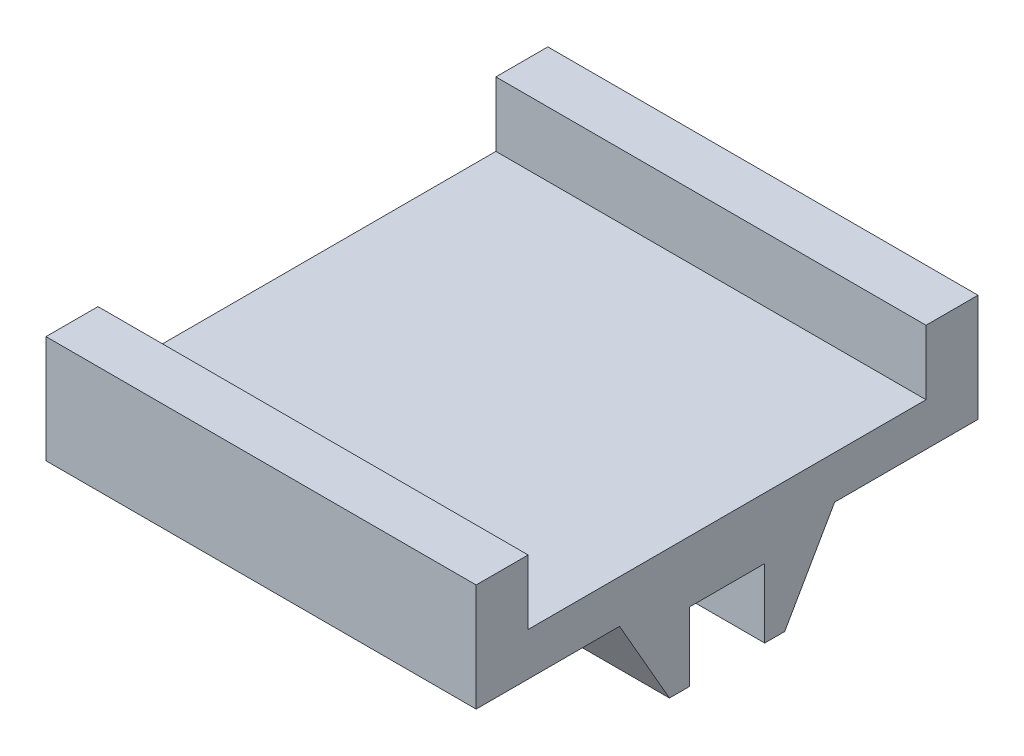
ISO-10303-21;
HEADER;
FILE_DESCRIPTION(('STEP AP214'),'2;1');
FILE_NAME('part.step','',(''),(''),'','','');
FILE_SCHEMA(('AUTOMOTIVE_DESIGN { 1 0 10303 214 1 1 1 1 }'));
ENDSEC;
DATA;
#1=APPLICATION_CONTEXT('core data for automotive mechanical design processes');
#2=APPLICATION_PROTOCOL_DEFINITION('international standard','automotive_design',2000,#1);
#3=PRODUCT_CONTEXT('',#1,'mechanical');
#4=PRODUCT('Part','Part','',(#3));
#5=PRODUCT_RELATED_PRODUCT_CATEGORY('part','',(#4));
#6=PRODUCT_DEFINITION_FORMATION('','',#4);
#7=PRODUCT_DEFINITION_CONTEXT('part definition',#1,'design');
#8=PRODUCT_DEFINITION('design','',#6,#7);
#9=PRODUCT_DEFINITION_SHAPE('','',#8);
#10=(LENGTH_UNIT() NAMED_UNIT(*) SI_UNIT(.MILLI.,.METRE.));
#11=(NAMED_UNIT(*) PLANE_ANGLE_UNIT() SI_UNIT($,.RADIAN.));
#12=(NAMED_UNIT(*) SI_UNIT($,.STERADIAN.) SOLID_ANGLE_UNIT());
#13=UNCERTAINTY_MEASURE_WITH_UNIT(LENGTH_MEASURE(1.E-05),#10,'distance_accuracy_value','');
#14=(GEOMETRIC_REPRESENTATION_CONTEXT(3) GLOBAL_UNCERTAINTY_ASSIGNED_CONTEXT((#13)) GLOBAL_UNIT_ASSIGNED_CONTEXT((#10,
#11,#12)) REPRESENTATION_CONTEXT('',''));
#15=CARTESIAN_POINT('',(0.,0.,0.));
#16=DIRECTION('',(0.,0.,1.));
#17=DIRECTION('',(1.,0.,0.));
#18=AXIS2_PLACEMENT_3D('',#15,#16,#17);
#19=CARTESIAN_POINT('',(0.,0.,0.));
#20=DIRECTION('',(0.,1.,0.));
#21=DIRECTION('',(0.,0.,1.));
#22=AXIS2_PLACEMENT_3D('',#19,#20,#21);
#23=PLANE('',#22);
#24=DIRECTION('',(-1.,0.,0.));
#25=VECTOR('',#24,1.);
#26=CARTESIAN_POINT('',(25.5472350230415,0.,-16.1117511520737));
#27=LINE('',#26,#25);
#28=CARTESIAN_POINT('',(25.5472350230415,0.,-16.1117511520737));
#29=VERTEX_POINT('',#28);
#30=CARTESIAN_POINT('',(-34.4527649769585,0.,-16.1117511520737));
#31=VERTEX_POINT('',#30);
#32=EDGE_CURVE('E224',#29,#31,#27,.T.);
#33=ORIENTED_EDGE('',*,*,#32,.F.);
#34=DIRECTION('',(0.,0.,-1.));
#35=VECTOR('',#34,1.);
#36=CARTESIAN_POINT('',(25.5472350230415,0.,3.88824884792627));
#37=LINE('',#36,#35);
#38=CARTESIAN_POINT('',(25.5472350230415,0.,3.88824884792627));
#39=VERTEX_POINT('',#38);
#40=EDGE_CURVE('E279',#39,#29,#37,.T.);
#41=ORIENTED_EDGE('',*,*,#40,.F.);
#42=DIRECTION('',(1.,0.,0.));
#43=VECTOR('',#42,1.);
#44=CARTESIAN_POINT('',(-34.4527649769585,0.,3.88824884792627));
#45=LINE('',#44,#43);
#46=CARTESIAN_POINT('',(-34.4527649769585,0.,3.88824884792627));
#47=VERTEX_POINT('',#46);
#48=EDGE_CURVE('E301',#47,#39,#45,.T.);
#49=ORIENTED_EDGE('',*,*,#48,.F.);
#50=DIRECTION('',(0.,0.,1.));
#51=VECTOR('',#50,1.);
#52=CARTESIAN_POINT('',(-34.4527649769585,0.,-66.1117511520737));
#53=LINE('',#52,#51);
#54=EDGE_CURVE('E296',#31,#47,#53,.T.);
#55=ORIENTED_EDGE('',*,*,#54,.F.);
#56=EDGE_LOOP('',(#33,#41,#49,#55));
#57=FACE_BOUND('',#56,.T.);
#58=ADVANCED_FACE('F39',(#57),#23,.F.);
#59=CARTESIAN_POINT('',(0.,15.,0.));
#60=DIRECTION('',(0.,1.,0.));
#61=DIRECTION('',(0.,0.,1.));
#62=AXIS2_PLACEMENT_3D('',#59,#60,#61);
#63=PLANE('',#62);
#64=DIRECTION('',(-1.,0.,0.));
#65=VECTOR('',#64,1.);
#66=CARTESIAN_POINT('',(25.5472350230415,15.,-3.36175115207375));
#67=LINE('',#66,#65);
#68=CARTESIAN_POINT('',(25.5472350230415,15.,-3.36175115207375));
#69=VERTEX_POINT('',#68);
#70=CARTESIAN_POINT('',(-34.4527649769585,15.,-3.36175115207373));
#71=VERTEX_POINT('',#70);
#72=EDGE_CURVE('E261',#69,#71,#67,.T.);
#73=ORIENTED_EDGE('',*,*,#72,.T.);
#74=DIRECTION('',(0.,0.,1.));
#75=VECTOR('',#74,1.);
#76=CARTESIAN_POINT('',(-34.4527649769585,15.,-66.1117511520737));
#77=LINE('',#76,#75);
#78=CARTESIAN_POINT('',(-34.4527649769585,15.,3.88824884792627));
#79=VERTEX_POINT('',#78);
#80=EDGE_CURVE('E278',#71,#79,#77,.T.);
#81=ORIENTED_EDGE('',*,*,#80,.T.);
#82=DIRECTION('',(1.,0.,0.));
#83=VECTOR('',#82,1.);
#84=CARTESIAN_POINT('',(-34.4527649769585,15.,3.88824884792627));
#85=LINE('',#84,#83);
#86=CARTESIAN_POINT('',(25.5472350230415,15.,3.88824884792627));
#87=VERTEX_POINT('',#86);
#88=EDGE_CURVE('E284',#79,#87,#85,.T.);
#89=ORIENTED_EDGE('',*,*,#88,.T.);
#90=DIRECTION('',(0.,0.,-1.));
#91=VECTOR('',#90,1.);
#92=CARTESIAN_POINT('',(25.5472350230415,15.,3.88824884792627));
#93=LINE('',#92,#91);
#94=EDGE_CURVE('E288',#87,#69,#93,.T.);
#95=ORIENTED_EDGE('',*,*,#94,.T.);
#96=EDGE_LOOP('',(#73,#81,#89,#95));
#97=FACE_BOUND('',#96,.T.);
#98=ADVANCED_FACE('F333',(#97),#63,.T.);
#99=CARTESIAN_POINT('',(25.5472350230415,15.,-66.1117511520737));
#100=DIRECTION('',(0.,0.,1.));
#101=DIRECTION('',(1.,0.,0.));
#102=AXIS2_PLACEMENT_3D('',#99,#100,#101);
#103=PLANE('',#102);
#104=DIRECTION('',(-1.,0.,0.));
#105=VECTOR('',#104,1.);
#106=CARTESIAN_POINT('',(25.5472350230415,0.,-66.1117511520737));
#107=LINE('',#106,#105);
#108=CARTESIAN_POINT('',(25.5472350230415,0.,-66.1117511520737));
#109=VERTEX_POINT('',#108);
#110=CARTESIAN_POINT('',(-34.4527649769585,0.,-66.1117511520737));
#111=VERTEX_POINT('',#110);
#112=EDGE_CURVE('E265',#109,#111,#107,.T.);
#113=ORIENTED_EDGE('',*,*,#112,.T.);
#114=DIRECTION('',(0.,-1.,0.));
#115=VECTOR('',#114,1.);
#116=CARTESIAN_POINT('',(-34.4527649769585,15.,-66.1117511520737));
#117=LINE('',#116,#115);
#118=CARTESIAN_POINT('',(-34.4527649769585,15.,-66.1117511520737));
#119=VERTEX_POINT('',#118);
#120=EDGE_CURVE('E11',#119,#111,#117,.T.);
#121=ORIENTED_EDGE('',*,*,#120,.F.);
#122=DIRECTION('',(-1.,0.,0.));
#123=VECTOR('',#122,1.);
#124=CARTESIAN_POINT('',(25.5472350230415,15.,-66.1117511520737));
#125=LINE('',#124,#123);
#126=CARTESIAN_POINT('',(25.5472350230415,15.,-66.1117511520737));
#127=VERTEX_POINT('',#126);
#128=EDGE_CURVE('E274',#127,#119,#125,.T.);
#129=ORIENTED_EDGE('',*,*,#128,.F.);
#130=DIRECTION('',(0.,-1.,0.));
#131=VECTOR('',#130,1.);
#132=CARTESIAN_POINT('',(25.5472350230415,15.,-66.1117511520737));
#133=LINE('',#132,#131);
#134=EDGE_CURVE('E292',#127,#109,#133,.T.);
#135=ORIENTED_EDGE('',*,*,#134,.T.);
#136=EDGE_LOOP('',(#113,#121,#129,#135));
#137=FACE_BOUND('',#136,.T.);
#138=ADVANCED_FACE('F41',(#137),#103,.F.);
#139=CARTESIAN_POINT('',(-34.4527649769585,15.,-66.1117511520737));
#140=DIRECTION('',(1.,0.,0.));
#141=DIRECTION('',(0.,0.,-1.));
#142=AXIS2_PLACEMENT_3D('',#139,#140,#141);
#143=PLANE('',#142);
#144=ORIENTED_EDGE('',*,*,#80,.F.);
#145=DIRECTION('',(0.,1.,0.));
#146=VECTOR('',#145,1.);
#147=CARTESIAN_POINT('',(-34.4527649769585,6.,-3.36175115207373));
#148=LINE('',#147,#146);
#149=CARTESIAN_POINT('',(-34.4527649769585,6.,-3.36175115207373));
#150=VERTEX_POINT('',#149);
#151=EDGE_CURVE('E244',#150,#71,#148,.T.);
#152=ORIENTED_EDGE('',*,*,#151,.F.);
#153=DIRECTION('',(0.,0.,1.));
#154=VECTOR('',#153,1.);
#155=CARTESIAN_POINT('',(-34.4527649769585,6.,-58.8617511520737));
#156=LINE('',#155,#154);
#157=CARTESIAN_POINT('',(-34.4527649769585,6.,-58.8617511520737));
#158=VERTEX_POINT('',#157);
#159=EDGE_CURVE('E255',#158,#150,#156,.T.);
#160=ORIENTED_EDGE('',*,*,#159,.F.);
#161=DIRECTION('',(0.,-1.,0.));
#162=VECTOR('',#161,1.);
#163=CARTESIAN_POINT('',(-34.4527649769585,15.,-58.8617511520737));
#164=LINE('',#163,#162);
#165=CARTESIAN_POINT('',(-34.4527649769585,15.,-58.8617511520737));
#166=VERTEX_POINT('',#165);
#167=EDGE_CURVE('E223',#166,#158,#164,.T.);
#168=ORIENTED_EDGE('',*,*,#167,.F.);
#169=EDGE_CURVE('E280',#119,#166,#77,.T.);
#170=ORIENTED_EDGE('',*,*,#169,.F.);
#171=ORIENTED_EDGE('',*,*,#120,.T.);
#172=CARTESIAN_POINT('',(-34.4527649769585,0.,-46.1117511520737));
#173=VERTEX_POINT('',#172);
#174=EDGE_CURVE('E297',#111,#173,#53,.T.);
#175=ORIENTED_EDGE('',*,*,#174,.T.);
#176=DIRECTION('',(0.,-0.867463976197283,0.4975));
#177=VECTOR('',#176,1.);
#178=CARTESIAN_POINT('',(-34.4527649769585,-12.144495666762,-39.1467511520737));
#179=LINE('',#178,#177);
#180=CARTESIAN_POINT('',(-34.4527649769585,-12.144495666762,-39.1467511520737));
#181=VERTEX_POINT('',#180);
#182=EDGE_CURVE('E55',#173,#181,#179,.T.);
#183=ORIENTED_EDGE('',*,*,#182,.T.);
#184=DIRECTION('',(0.,0.,1.));
#185=VECTOR('',#184,1.);
#186=CARTESIAN_POINT('',(-34.4527649769585,-12.144495666762,-39.1467511520737));
#187=LINE('',#186,#185);
#188=CARTESIAN_POINT('',(-34.4527649769585,-12.144495666762,-36.3617511520737));
#189=VERTEX_POINT('',#188);
#190=EDGE_CURVE('E158',#181,#189,#187,.T.);
#191=ORIENTED_EDGE('',*,*,#190,.T.);
#192=DIRECTION('',(0.,1.,0.));
#193=VECTOR('',#192,1.);
#194=CARTESIAN_POINT('',(-34.4527649769585,-12.144495666762,-36.3617511520737));
#195=LINE('',#194,#193);
#196=CARTESIAN_POINT('',(-34.4527649769585,-2.5373737780706,-36.3617511520737));
#197=VERTEX_POINT('',#196);
#198=EDGE_CURVE('E206',#189,#197,#195,.T.);
#199=ORIENTED_EDGE('',*,*,#198,.T.);
#200=DIRECTION('',(0.,0.,1.));
#201=VECTOR('',#200,1.);
#202=CARTESIAN_POINT('',(-34.4527649769585,-2.5373737780706,-36.3617511520737));
#203=LINE('',#202,#201);
#204=CARTESIAN_POINT('',(-34.4527649769585,-2.5373737780706,-25.8617511520737));
#205=VERTEX_POINT('',#204);
#206=EDGE_CURVE('E210',#197,#205,#203,.T.);
#207=ORIENTED_EDGE('',*,*,#206,.T.);
#208=DIRECTION('',(0.,-1.,0.));
#209=VECTOR('',#208,1.);
#210=CARTESIAN_POINT('',(-34.4527649769585,-2.5373737780706,-25.8617511520737));
#211=LINE('',#210,#209);
#212=CARTESIAN_POINT('',(-34.4527649769585,-12.144495666762,-25.8617511520737));
#213=VERTEX_POINT('',#212);
#214=EDGE_CURVE('E214',#205,#213,#211,.T.);
#215=ORIENTED_EDGE('',*,*,#214,.T.);
#216=DIRECTION('',(0.,0.,1.));
#217=VECTOR('',#216,1.);
#218=CARTESIAN_POINT('',(-34.4527649769585,-12.144495666762,-25.8617511520737));
#219=LINE('',#218,#217);
#220=CARTESIAN_POINT('',(-34.4527649769585,-12.144495666762,-23.0767511520737));
#221=VERTEX_POINT('',#220);
#222=EDGE_CURVE('E183',#213,#221,#219,.T.);
#223=ORIENTED_EDGE('',*,*,#222,.T.);
#224=DIRECTION('',(0.,0.867463976197283,0.4975));
#225=VECTOR('',#224,1.);
#226=CARTESIAN_POINT('',(-34.4527649769585,0.,-16.1117511520737));
#227=LINE('',#226,#225);
#228=EDGE_CURVE('E179',#221,#31,#227,.T.);
#229=ORIENTED_EDGE('',*,*,#228,.T.);
#230=ORIENTED_EDGE('',*,*,#54,.T.);
#231=DIRECTION('',(0.,-1.,0.));
#232=VECTOR('',#231,1.);
#233=CARTESIAN_POINT('',(-34.4527649769585,15.,3.88824884792627));
#234=LINE('',#233,#232);
#235=EDGE_CURVE('E48',#79,#47,#234,.T.);
#236=ORIENTED_EDGE('',*,*,#235,.F.);
#237=EDGE_LOOP('',(#144,#152,#160,#168,#170,#171,#175,#183,#191,#199,#207,#215,#223,#229,#230,#236));
#238=FACE_BOUND('',#237,.T.);
#239=ADVANCED_FACE('F338',(#238),#143,.F.);
#240=CARTESIAN_POINT('',(-34.4527649769585,15.,3.88824884792627));
#241=DIRECTION('',(0.,0.,-1.));
#242=DIRECTION('',(-1.,0.,0.));
#243=AXIS2_PLACEMENT_3D('',#240,#241,#242);
#244=PLANE('',#243);
#245=ORIENTED_EDGE('',*,*,#48,.T.);
#246=DIRECTION('',(0.,-1.,0.));
#247=VECTOR('',#246,1.);
#248=CARTESIAN_POINT('',(25.5472350230415,15.,3.88824884792627));
#249=LINE('',#248,#247);
#250=EDGE_CURVE('E311',#87,#39,#249,.T.);
#251=ORIENTED_EDGE('',*,*,#250,.F.);
#252=ORIENTED_EDGE('',*,*,#88,.F.);
#253=ORIENTED_EDGE('',*,*,#235,.T.);
#254=EDGE_LOOP('',(#245,#251,#252,#253));
#255=FACE_BOUND('',#254,.T.);
#256=ADVANCED_FACE('F320',(#255),#244,.F.);
#257=CARTESIAN_POINT('',(25.5472350230415,15.,3.88824884792627));
#258=DIRECTION('',(-1.,0.,0.));
#259=DIRECTION('',(0.,0.,1.));
#260=AXIS2_PLACEMENT_3D('',#257,#258,#259);
#261=PLANE('',#260);
#262=DIRECTION('',(0.,0.,1.));
#263=VECTOR('',#262,1.);
#264=CARTESIAN_POINT('',(25.5472350230415,6.,-58.8617511520737));
#265=LINE('',#264,#263);
#266=CARTESIAN_POINT('',(25.5472350230415,6.,-58.8617511520737));
#267=VERTEX_POINT('',#266);
#268=CARTESIAN_POINT('',(25.5472350230415,6.,-3.36175115207375));
#269=VERTEX_POINT('',#268);
#270=EDGE_CURVE('E243',#267,#269,#265,.T.);
#271=ORIENTED_EDGE('',*,*,#270,.T.);
#272=DIRECTION('',(0.,1.,0.));
#273=VECTOR('',#272,1.);
#274=CARTESIAN_POINT('',(25.5472350230415,6.,-3.36175115207375));
#275=LINE('',#274,#273);
#276=EDGE_CURVE('E247',#269,#69,#275,.T.);
#277=ORIENTED_EDGE('',*,*,#276,.T.);
#278=ORIENTED_EDGE('',*,*,#94,.F.);
#279=ORIENTED_EDGE('',*,*,#250,.T.);
#280=ORIENTED_EDGE('',*,*,#40,.T.);
#281=DIRECTION('',(0.,0.867463976197283,0.4975));
#282=VECTOR('',#281,1.);
#283=CARTESIAN_POINT('',(25.5472350230415,0.,-16.1117511520737));
#284=LINE('',#283,#282);
#285=CARTESIAN_POINT('',(25.5472350230415,-12.144495666762,-23.0767511520737));
#286=VERTEX_POINT('',#285);
#287=EDGE_CURVE('E162',#286,#29,#284,.T.);
#288=ORIENTED_EDGE('',*,*,#287,.F.);
#289=DIRECTION('',(0.,0.,1.));
#290=VECTOR('',#289,1.);
#291=CARTESIAN_POINT('',(25.5472350230415,-12.144495666762,-25.8617511520737));
#292=LINE('',#291,#290);
#293=CARTESIAN_POINT('',(25.5472350230415,-12.144495666762,-25.8617511520737));
#294=VERTEX_POINT('',#293);
#295=EDGE_CURVE('E196',#294,#286,#292,.T.);
#296=ORIENTED_EDGE('',*,*,#295,.F.);
#297=DIRECTION('',(0.,-1.,0.));
#298=VECTOR('',#297,1.);
#299=CARTESIAN_POINT('',(25.5472350230415,-2.5373737780706,-25.8617511520737));
#300=LINE('',#299,#298);
#301=CARTESIAN_POINT('',(25.5472350230415,-2.5373737780706,-25.8617511520737));
#302=VERTEX_POINT('',#301);
#303=EDGE_CURVE('E192',#302,#294,#300,.T.);
#304=ORIENTED_EDGE('',*,*,#303,.F.);
#305=DIRECTION('',(0.,0.,1.));
#306=VECTOR('',#305,1.);
#307=CARTESIAN_POINT('',(25.5472350230415,-2.5373737780706,-36.3617511520737));
#308=LINE('',#307,#306);
#309=CARTESIAN_POINT('',(25.5472350230415,-2.5373737780706,-36.3617511520737));
#310=VERTEX_POINT('',#309);
#311=EDGE_CURVE('E188',#310,#302,#308,.T.);
#312=ORIENTED_EDGE('',*,*,#311,.F.);
#313=DIRECTION('',(0.,1.,0.));
#314=VECTOR('',#313,1.);
#315=CARTESIAN_POINT('',(25.5472350230415,-12.144495666762,-36.3617511520737));
#316=LINE('',#315,#314);
#317=CARTESIAN_POINT('',(25.5472350230415,-12.144495666762,-36.3617511520737));
#318=VERTEX_POINT('',#317);
#319=EDGE_CURVE('E173',#318,#310,#316,.T.);
#320=ORIENTED_EDGE('',*,*,#319,.F.);
#321=DIRECTION('',(0.,0.,1.));
#322=VECTOR('',#321,1.);
#323=CARTESIAN_POINT('',(25.5472350230415,-12.144495666762,-39.1467511520737));
#324=LINE('',#323,#322);
#325=CARTESIAN_POINT('',(25.5472350230415,-12.144495666762,-39.1467511520737));
#326=VERTEX_POINT('',#325);
#327=EDGE_CURVE('E156',#326,#318,#324,.T.);
#328=ORIENTED_EDGE('',*,*,#327,.F.);
#329=DIRECTION('',(0.,-0.867463976197283,0.4975));
#330=VECTOR('',#329,1.);
#331=CARTESIAN_POINT('',(25.5472350230415,-12.144495666762,-39.1467511520737));
#332=LINE('',#331,#330);
#333=CARTESIAN_POINT('',(25.5472350230415,0.,-46.1117511520737));
#334=VERTEX_POINT('',#333);
#335=EDGE_CURVE('E169',#334,#326,#332,.T.);
#336=ORIENTED_EDGE('',*,*,#335,.F.);
#337=EDGE_CURVE('E304',#334,#109,#37,.T.);
#338=ORIENTED_EDGE('',*,*,#337,.T.);
#339=ORIENTED_EDGE('',*,*,#134,.F.);
#340=CARTESIAN_POINT('',(25.5472350230415,15.,-58.8617511520737));
#341=VERTEX_POINT('',#340);
#342=EDGE_CURVE('E287',#341,#127,#93,.T.);
#343=ORIENTED_EDGE('',*,*,#342,.F.);
#344=DIRECTION('',(0.,-1.,0.));
#345=VECTOR('',#344,1.);
#346=CARTESIAN_POINT('',(25.5472350230415,15.,-58.8617511520737));
#347=LINE('',#346,#345);
#348=EDGE_CURVE('E63',#341,#267,#347,.T.);
#349=ORIENTED_EDGE('',*,*,#348,.T.);
#350=EDGE_LOOP('',(#271,#277,#278,#279,#280,#288,#296,#304,#312,#320,#328,#336,#338,#339,#343,#349));
#351=FACE_BOUND('',#350,.T.);
#352=ADVANCED_FACE('F168',(#351),#261,.F.);
#353=DIRECTION('',(-1.,0.,0.));
#354=VECTOR('',#353,1.);
#355=CARTESIAN_POINT('',(25.5472350230415,15.,-58.8617511520737));
#356=LINE('',#355,#354);
#357=EDGE_CURVE('E251',#341,#166,#356,.T.);
#358=ORIENTED_EDGE('',*,*,#357,.F.);
#359=ORIENTED_EDGE('',*,*,#342,.T.);
#360=ORIENTED_EDGE('',*,*,#128,.T.);
#361=ORIENTED_EDGE('',*,*,#169,.T.);
#362=EDGE_LOOP('',(#358,#359,#360,#361));
#363=FACE_BOUND('',#362,.T.);
#364=ADVANCED_FACE('F364',(#363),#63,.T.);
#365=ORIENTED_EDGE('',*,*,#337,.F.);
#366=DIRECTION('',(-1.,0.,0.));
#367=VECTOR('',#366,1.);
#368=CARTESIAN_POINT('',(25.5472350230415,0.,-46.1117511520737));
#369=LINE('',#368,#367);
#370=EDGE_CURVE('E177',#334,#173,#369,.T.);
#371=ORIENTED_EDGE('',*,*,#370,.T.);
#372=ORIENTED_EDGE('',*,*,#174,.F.);
#373=ORIENTED_EDGE('',*,*,#112,.F.);
#374=EDGE_LOOP('',(#365,#371,#372,#373));
#375=FACE_BOUND('',#374,.T.);
#376=ADVANCED_FACE('F358',(#375),#23,.F.);
#377=CARTESIAN_POINT('',(25.5472350230415,6.,-3.36175115207375));
#378=DIRECTION('',(0.,0.,1.));
#379=DIRECTION('',(1.,0.,0.));
#380=AXIS2_PLACEMENT_3D('',#377,#378,#379);
#381=PLANE('',#380);
#382=ORIENTED_EDGE('',*,*,#151,.T.);
#383=ORIENTED_EDGE('',*,*,#72,.F.);
#384=ORIENTED_EDGE('',*,*,#276,.F.);
#385=DIRECTION('',(-1.,0.,0.));
#386=VECTOR('',#385,1.);
#387=CARTESIAN_POINT('',(25.5472350230415,6.,-3.36175115207375));
#388=LINE('',#387,#386);
#389=EDGE_CURVE('E266',#269,#150,#388,.T.);
#390=ORIENTED_EDGE('',*,*,#389,.T.);
#391=EDGE_LOOP('',(#382,#383,#384,#390));
#392=FACE_BOUND('',#391,.T.);
#393=ADVANCED_FACE('F371',(#392),#381,.F.);
#394=CARTESIAN_POINT('',(25.5472350230415,6.,-58.8617511520737));
#395=DIRECTION('',(0.,-1.,0.));
#396=DIRECTION('',(0.,0.,-1.));
#397=AXIS2_PLACEMENT_3D('',#394,#395,#396);
#398=PLANE('',#397);
#399=ORIENTED_EDGE('',*,*,#159,.T.);
#400=ORIENTED_EDGE('',*,*,#389,.F.);
#401=ORIENTED_EDGE('',*,*,#270,.F.);
#402=DIRECTION('',(-1.,0.,0.));
#403=VECTOR('',#402,1.);
#404=CARTESIAN_POINT('',(25.5472350230415,6.,-58.8617511520737));
#405=LINE('',#404,#403);
#406=EDGE_CURVE('E269',#267,#158,#405,.T.);
#407=ORIENTED_EDGE('',*,*,#406,.T.);
#408=EDGE_LOOP('',(#399,#400,#401,#407));
#409=FACE_BOUND('',#408,.T.);
#410=ADVANCED_FACE('F368',(#409),#398,.F.);
#411=CARTESIAN_POINT('',(25.5472350230415,15.,-58.8617511520737));
#412=DIRECTION('',(0.,0.,-1.));
#413=DIRECTION('',(-1.,0.,0.));
#414=AXIS2_PLACEMENT_3D('',#411,#412,#413);
#415=PLANE('',#414);
#416=ORIENTED_EDGE('',*,*,#167,.T.);
#417=ORIENTED_EDGE('',*,*,#406,.F.);
#418=ORIENTED_EDGE('',*,*,#348,.F.);
#419=ORIENTED_EDGE('',*,*,#357,.T.);
#420=EDGE_LOOP('',(#416,#417,#418,#419));
#421=FACE_BOUND('',#420,.T.);
#422=ADVANCED_FACE('F373',(#421),#415,.F.);
#423=CARTESIAN_POINT('',(25.5472350230415,-12.144495666762,-39.1467511520737));
#424=DIRECTION('',(0.,-0.4975,-0.867463976197283));
#425=DIRECTION('',(0.,0.867463976197283,-0.4975));
#426=AXIS2_PLACEMENT_3D('',#423,#424,#425);
#427=PLANE('',#426);
#428=ORIENTED_EDGE('',*,*,#182,.F.);
#429=ORIENTED_EDGE('',*,*,#370,.F.);
#430=ORIENTED_EDGE('',*,*,#335,.T.);
#431=DIRECTION('',(-1.,0.,0.));
#432=VECTOR('',#431,1.);
#433=CARTESIAN_POINT('',(25.5472350230415,-12.144495666762,-39.1467511520737));
#434=LINE('',#433,#432);
#435=EDGE_CURVE('E153',#326,#181,#434,.T.);
#436=ORIENTED_EDGE('',*,*,#435,.T.);
#437=EDGE_LOOP('',(#428,#429,#430,#436));
#438=FACE_BOUND('',#437,.T.);
#439=ADVANCED_FACE('F176',(#438),#427,.T.);
#440=CARTESIAN_POINT('',(25.5472350230415,0.,-16.1117511520737));
#441=DIRECTION('',(0.,-0.4975,0.867463976197283));
#442=DIRECTION('',(0.,-0.867463976197283,-0.4975));
#443=AXIS2_PLACEMENT_3D('',#440,#441,#442);
#444=PLANE('',#443);
#445=ORIENTED_EDGE('',*,*,#228,.F.);
#446=DIRECTION('',(-1.,0.,0.));
#447=VECTOR('',#446,1.);
#448=CARTESIAN_POINT('',(25.5472350230415,-12.144495666762,-23.0767511520737));
#449=LINE('',#448,#447);
#450=EDGE_CURVE('E227',#286,#221,#449,.T.);
#451=ORIENTED_EDGE('',*,*,#450,.F.);
#452=ORIENTED_EDGE('',*,*,#287,.T.);
#453=ORIENTED_EDGE('',*,*,#32,.T.);
#454=EDGE_LOOP('',(#445,#451,#452,#453));
#455=FACE_BOUND('',#454,.T.);
#456=ADVANCED_FACE('F342',(#455),#444,.T.);
#457=CARTESIAN_POINT('',(25.5472350230415,-12.144495666762,-25.8617511520737));
#458=DIRECTION('',(0.,-1.,0.));
#459=DIRECTION('',(0.,0.,-1.));
#460=AXIS2_PLACEMENT_3D('',#457,#458,#459);
#461=PLANE('',#460);
#462=ORIENTED_EDGE('',*,*,#222,.F.);
#463=DIRECTION('',(-1.,0.,0.));
#464=VECTOR('',#463,1.);
#465=CARTESIAN_POINT('',(25.5472350230415,-12.144495666762,-25.8617511520737));
#466=LINE('',#465,#464);
#467=EDGE_CURVE('E230',#294,#213,#466,.T.);
#468=ORIENTED_EDGE('',*,*,#467,.F.);
#469=ORIENTED_EDGE('',*,*,#295,.T.);
#470=ORIENTED_EDGE('',*,*,#450,.T.);
#471=EDGE_LOOP('',(#462,#468,#469,#470));
#472=FACE_BOUND('',#471,.T.);
#473=ADVANCED_FACE('F344',(#472),#461,.T.);
#474=CARTESIAN_POINT('',(25.5472350230415,-2.5373737780706,-25.8617511520737));
#475=DIRECTION('',(0.,0.,-1.));
#476=DIRECTION('',(-1.,0.,0.));
#477=AXIS2_PLACEMENT_3D('',#474,#475,#476);
#478=PLANE('',#477);
#479=ORIENTED_EDGE('',*,*,#214,.F.);
#480=DIRECTION('',(-1.,0.,0.));
#481=VECTOR('',#480,1.);
#482=CARTESIAN_POINT('',(25.5472350230415,-2.5373737780706,-25.8617511520737));
#483=LINE('',#482,#481);
#484=EDGE_CURVE('E233',#302,#205,#483,.T.);
#485=ORIENTED_EDGE('',*,*,#484,.F.);
#486=ORIENTED_EDGE('',*,*,#303,.T.);
#487=ORIENTED_EDGE('',*,*,#467,.T.);
#488=EDGE_LOOP('',(#479,#485,#486,#487));
#489=FACE_BOUND('',#488,.T.);
#490=ADVANCED_FACE('F348',(#489),#478,.T.);
#491=CARTESIAN_POINT('',(25.5472350230415,-2.5373737780706,-36.3617511520737));
#492=DIRECTION('',(0.,-1.,0.));
#493=DIRECTION('',(0.,0.,-1.));
#494=AXIS2_PLACEMENT_3D('',#491,#492,#493);
#495=PLANE('',#494);
#496=ORIENTED_EDGE('',*,*,#206,.F.);
#497=DIRECTION('',(-1.,0.,0.));
#498=VECTOR('',#497,1.);
#499=CARTESIAN_POINT('',(25.5472350230415,-2.5373737780706,-36.3617511520737));
#500=LINE('',#499,#498);
#501=EDGE_CURVE('E236',#310,#197,#500,.T.);
#502=ORIENTED_EDGE('',*,*,#501,.F.);
#503=ORIENTED_EDGE('',*,*,#311,.T.);
#504=ORIENTED_EDGE('',*,*,#484,.T.);
#505=EDGE_LOOP('',(#496,#502,#503,#504));
#506=FACE_BOUND('',#505,.T.);
#507=ADVANCED_FACE('F351',(#506),#495,.T.);
#508=CARTESIAN_POINT('',(25.5472350230415,-12.144495666762,-36.3617511520737));
#509=DIRECTION('',(0.,0.,1.));
#510=DIRECTION('',(1.,0.,0.));
#511=AXIS2_PLACEMENT_3D('',#508,#509,#510);
#512=PLANE('',#511);
#513=ORIENTED_EDGE('',*,*,#198,.F.);
#514=DIRECTION('',(-1.,0.,0.));
#515=VECTOR('',#514,1.);
#516=CARTESIAN_POINT('',(25.5472350230415,-12.144495666762,-36.3617511520737));
#517=LINE('',#516,#515);
#518=EDGE_CURVE('E161',#318,#189,#517,.T.);
#519=ORIENTED_EDGE('',*,*,#518,.F.);
#520=ORIENTED_EDGE('',*,*,#319,.T.);
#521=ORIENTED_EDGE('',*,*,#501,.T.);
#522=EDGE_LOOP('',(#513,#519,#520,#521));
#523=FACE_BOUND('',#522,.T.);
#524=ADVANCED_FACE('F354',(#523),#512,.T.);
#525=CARTESIAN_POINT('',(25.5472350230415,-12.144495666762,-39.1467511520737));
#526=DIRECTION('',(0.,-1.,0.));
#527=DIRECTION('',(0.,0.,-1.));
#528=AXIS2_PLACEMENT_3D('',#525,#526,#527);
#529=PLANE('',#528);
#530=ORIENTED_EDGE('',*,*,#190,.F.);
#531=ORIENTED_EDGE('',*,*,#435,.F.);
#532=ORIENTED_EDGE('',*,*,#327,.T.);
#533=ORIENTED_EDGE('',*,*,#518,.T.);
#534=EDGE_LOOP('',(#530,#531,#532,#533));
#535=FACE_BOUND('',#534,.T.);
#536=ADVANCED_FACE('F155',(#535),#529,.T.);
#537=CLOSED_SHELL('',(#58,#98,#138,#239,#256,#352,#364,#376,#393,#410,#422,#439,#456,#473,#490,
#507,#524,#536));
#538=MANIFOLD_SOLID_BREP('B2',#537);
#539=ADVANCED_BREP_SHAPE_REPRESENTATION('',(#18,#538),#14);
#540=SHAPE_DEFINITION_REPRESENTATION(#9,#539);
ENDSEC;
END-ISO-10303-21;
